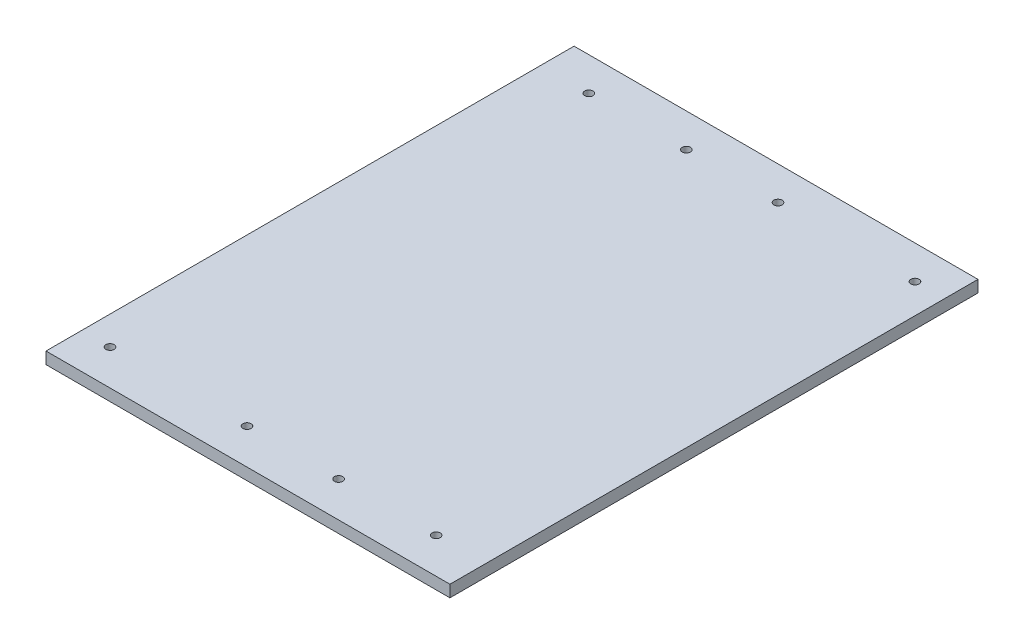
ISO-10303-21;
HEADER;
FILE_DESCRIPTION(('STEP AP214'),'2;1');
FILE_NAME('part.step','',(''),(''),'','','');
FILE_SCHEMA(('AUTOMOTIVE_DESIGN { 1 0 10303 214 1 1 1 1 }'));
ENDSEC;
DATA;
#1=APPLICATION_CONTEXT('core data for automotive mechanical design processes');
#2=APPLICATION_PROTOCOL_DEFINITION('international standard','automotive_design',2000,#1);
#3=PRODUCT_CONTEXT('',#1,'mechanical');
#4=PRODUCT('Part','Part','',(#3));
#5=PRODUCT_RELATED_PRODUCT_CATEGORY('part','',(#4));
#6=PRODUCT_DEFINITION_FORMATION('','',#4);
#7=PRODUCT_DEFINITION_CONTEXT('part definition',#1,'design');
#8=PRODUCT_DEFINITION('design','',#6,#7);
#9=PRODUCT_DEFINITION_SHAPE('','',#8);
#10=(LENGTH_UNIT() NAMED_UNIT(*) SI_UNIT(.MILLI.,.METRE.));
#11=(NAMED_UNIT(*) PLANE_ANGLE_UNIT() SI_UNIT($,.RADIAN.));
#12=(NAMED_UNIT(*) SI_UNIT($,.STERADIAN.) SOLID_ANGLE_UNIT());
#13=UNCERTAINTY_MEASURE_WITH_UNIT(LENGTH_MEASURE(1.E-05),#10,'distance_accuracy_value','');
#14=(GEOMETRIC_REPRESENTATION_CONTEXT(3) GLOBAL_UNCERTAINTY_ASSIGNED_CONTEXT((#13)) GLOBAL_UNIT_ASSIGNED_CONTEXT((#10,
#11,#12)) REPRESENTATION_CONTEXT('',''));
#15=CARTESIAN_POINT('',(0.,0.,0.));
#16=DIRECTION('',(0.,0.,1.));
#17=DIRECTION('',(1.,0.,0.));
#18=AXIS2_PLACEMENT_3D('',#15,#16,#17);
#19=CARTESIAN_POINT('',(102.5,6.,-134.));
#20=DIRECTION('',(1.,0.,0.));
#21=DIRECTION('',(0.,0.,-1.));
#22=AXIS2_PLACEMENT_3D('',#19,#20,#21);
#23=PLANE('',#22);
#24=DIRECTION('',(0.,0.,1.));
#25=VECTOR('',#24,1.);
#26=CARTESIAN_POINT('',(102.5,0.,-134.));
#27=LINE('',#26,#25);
#28=CARTESIAN_POINT('',(102.5,0.,-134.));
#29=VERTEX_POINT('',#28);
#30=CARTESIAN_POINT('',(102.5,0.,134.));
#31=VERTEX_POINT('',#30);
#32=EDGE_CURVE('E106',#29,#31,#27,.T.);
#33=ORIENTED_EDGE('',*,*,#32,.F.);
#34=DIRECTION('',(0.,-1.,0.));
#35=VECTOR('',#34,1.);
#36=CARTESIAN_POINT('',(102.5,6.,-134.));
#37=LINE('',#36,#35);
#38=CARTESIAN_POINT('',(102.5,6.,-134.));
#39=VERTEX_POINT('',#38);
#40=EDGE_CURVE('E12',#39,#29,#37,.T.);
#41=ORIENTED_EDGE('',*,*,#40,.F.);
#42=DIRECTION('',(0.,0.,1.));
#43=VECTOR('',#42,1.);
#44=CARTESIAN_POINT('',(102.5,6.,-134.));
#45=LINE('',#44,#43);
#46=CARTESIAN_POINT('',(102.5,6.,134.));
#47=VERTEX_POINT('',#46);
#48=EDGE_CURVE('E99',#39,#47,#45,.T.);
#49=ORIENTED_EDGE('',*,*,#48,.T.);
#50=DIRECTION('',(0.,-1.,0.));
#51=VECTOR('',#50,1.);
#52=CARTESIAN_POINT('',(102.5,6.,134.));
#53=LINE('',#52,#51);
#54=EDGE_CURVE('E44',#47,#31,#53,.T.);
#55=ORIENTED_EDGE('',*,*,#54,.T.);
#56=EDGE_LOOP('',(#33,#41,#49,#55));
#57=FACE_BOUND('',#56,.T.);
#58=ADVANCED_FACE('F41',(#57),#23,.T.);
#59=CARTESIAN_POINT('',(-102.5,6.,-134.));
#60=DIRECTION('',(0.,0.,-1.));
#61=DIRECTION('',(-1.,0.,0.));
#62=AXIS2_PLACEMENT_3D('',#59,#60,#61);
#63=PLANE('',#62);
#64=DIRECTION('',(1.,0.,0.));
#65=VECTOR('',#64,1.);
#66=CARTESIAN_POINT('',(-102.5,0.,-134.));
#67=LINE('',#66,#65);
#68=CARTESIAN_POINT('',(-102.5,0.,-134.));
#69=VERTEX_POINT('',#68);
#70=EDGE_CURVE('E101',#69,#29,#67,.T.);
#71=ORIENTED_EDGE('',*,*,#70,.F.);
#72=DIRECTION('',(0.,-1.,0.));
#73=VECTOR('',#72,1.);
#74=CARTESIAN_POINT('',(-102.5,6.,-134.));
#75=LINE('',#74,#73);
#76=CARTESIAN_POINT('',(-102.5,6.,-134.));
#77=VERTEX_POINT('',#76);
#78=EDGE_CURVE('E50',#77,#69,#75,.T.);
#79=ORIENTED_EDGE('',*,*,#78,.F.);
#80=DIRECTION('',(1.,0.,0.));
#81=VECTOR('',#80,1.);
#82=CARTESIAN_POINT('',(-102.5,6.,-134.));
#83=LINE('',#82,#81);
#84=EDGE_CURVE('E96',#77,#39,#83,.T.);
#85=ORIENTED_EDGE('',*,*,#84,.T.);
#86=ORIENTED_EDGE('',*,*,#40,.T.);
#87=EDGE_LOOP('',(#71,#79,#85,#86));
#88=FACE_BOUND('',#87,.T.);
#89=ADVANCED_FACE('F125',(#88),#63,.T.);
#90=CARTESIAN_POINT('',(-102.5,6.,-134.));
#91=DIRECTION('',(-1.,0.,0.));
#92=DIRECTION('',(0.,0.,1.));
#93=AXIS2_PLACEMENT_3D('',#90,#91,#92);
#94=PLANE('',#93);
#95=DIRECTION('',(0.,0.,-1.));
#96=VECTOR('',#95,1.);
#97=CARTESIAN_POINT('',(-102.5,0.,-134.));
#98=LINE('',#97,#96);
#99=CARTESIAN_POINT('',(-102.5,0.,134.));
#100=VERTEX_POINT('',#99);
#101=EDGE_CURVE('E91',#100,#69,#98,.T.);
#102=ORIENTED_EDGE('',*,*,#101,.F.);
#103=DIRECTION('',(0.,-1.,0.));
#104=VECTOR('',#103,1.);
#105=CARTESIAN_POINT('',(-102.5,6.,134.));
#106=LINE('',#105,#104);
#107=CARTESIAN_POINT('',(-102.5,6.,134.));
#108=VERTEX_POINT('',#107);
#109=EDGE_CURVE('E86',#108,#100,#106,.T.);
#110=ORIENTED_EDGE('',*,*,#109,.F.);
#111=DIRECTION('',(0.,0.,-1.));
#112=VECTOR('',#111,1.);
#113=CARTESIAN_POINT('',(-102.5,6.,-134.));
#114=LINE('',#113,#112);
#115=EDGE_CURVE('E89',#108,#77,#114,.T.);
#116=ORIENTED_EDGE('',*,*,#115,.T.);
#117=ORIENTED_EDGE('',*,*,#78,.T.);
#118=EDGE_LOOP('',(#102,#110,#116,#117));
#119=FACE_BOUND('',#118,.T.);
#120=ADVANCED_FACE('F88',(#119),#94,.T.);
#121=CARTESIAN_POINT('',(-102.5,6.,134.));
#122=DIRECTION('',(0.,0.,1.));
#123=DIRECTION('',(1.,0.,0.));
#124=AXIS2_PLACEMENT_3D('',#121,#122,#123);
#125=PLANE('',#124);
#126=DIRECTION('',(-1.,0.,0.));
#127=VECTOR('',#126,1.);
#128=CARTESIAN_POINT('',(-102.5,0.,134.));
#129=LINE('',#128,#127);
#130=EDGE_CURVE('E110',#31,#100,#129,.T.);
#131=ORIENTED_EDGE('',*,*,#130,.F.);
#132=ORIENTED_EDGE('',*,*,#54,.F.);
#133=DIRECTION('',(-1.,0.,0.));
#134=VECTOR('',#133,1.);
#135=CARTESIAN_POINT('',(-102.5,6.,134.));
#136=LINE('',#135,#134);
#137=EDGE_CURVE('E95',#47,#108,#136,.T.);
#138=ORIENTED_EDGE('',*,*,#137,.T.);
#139=ORIENTED_EDGE('',*,*,#109,.T.);
#140=EDGE_LOOP('',(#131,#132,#138,#139));
#141=FACE_BOUND('',#140,.T.);
#142=ADVANCED_FACE('F98',(#141),#125,.T.);
#143=CARTESIAN_POINT('',(0.,6.,0.));
#144=DIRECTION('',(0.,1.,0.));
#145=DIRECTION('',(0.,0.,1.));
#146=AXIS2_PLACEMENT_3D('',#143,#144,#145);
#147=PLANE('',#146);
#148=CARTESIAN_POINT('',(87.5,6.,-117.000000000001));
#149=DIRECTION('',(0.,-1.,0.));
#150=DIRECTION('',(0.,0.,-1.));
#151=AXIS2_PLACEMENT_3D('',#148,#149,#150);
#152=CIRCLE('',#151,2.1);
#153=CARTESIAN_POINT('',(87.5,6.,-119.100000000001));
#154=VERTEX_POINT('',#153);
#155=EDGE_CURVE('E182',#154,#154,#152,.T.);
#156=ORIENTED_EDGE('',*,*,#155,.T.);
#157=EDGE_LOOP('',(#156));
#158=FACE_BOUND('',#157,.T.);
#159=CARTESIAN_POINT('',(18.,6.,-117.000000000001));
#160=DIRECTION('',(0.,-1.,0.));
#161=DIRECTION('',(0.,0.,-1.));
#162=AXIS2_PLACEMENT_3D('',#159,#160,#161);
#163=CIRCLE('',#162,2.1);
#164=CARTESIAN_POINT('',(18.,6.,-119.100000000001));
#165=VERTEX_POINT('',#164);
#166=EDGE_CURVE('E199',#165,#165,#163,.T.);
#167=ORIENTED_EDGE('',*,*,#166,.T.);
#168=EDGE_LOOP('',(#167));
#169=FACE_BOUND('',#168,.T.);
#170=CARTESIAN_POINT('',(77.5,6.,115.999999999999));
#171=DIRECTION('',(0.,-1.,0.));
#172=DIRECTION('',(0.,0.,-1.));
#173=AXIS2_PLACEMENT_3D('',#170,#171,#172);
#174=CIRCLE('',#173,2.1);
#175=CARTESIAN_POINT('',(77.5,6.,113.899999999999));
#176=VERTEX_POINT('',#175);
#177=EDGE_CURVE('E205',#176,#176,#174,.T.);
#178=ORIENTED_EDGE('',*,*,#177,.T.);
#179=EDGE_LOOP('',(#178));
#180=FACE_BOUND('',#179,.T.);
#181=CARTESIAN_POINT('',(28.,6.,115.999999999999));
#182=DIRECTION('',(0.,-1.,0.));
#183=DIRECTION('',(0.,0.,-1.));
#184=AXIS2_PLACEMENT_3D('',#181,#182,#183);
#185=CIRCLE('',#184,2.1);
#186=CARTESIAN_POINT('',(28.,6.,113.899999999999));
#187=VERTEX_POINT('',#186);
#188=EDGE_CURVE('E212',#187,#187,#185,.T.);
#189=ORIENTED_EDGE('',*,*,#188,.T.);
#190=EDGE_LOOP('',(#189));
#191=FACE_BOUND('',#190,.T.);
#192=CARTESIAN_POINT('',(-18.5,6.,116.));
#193=DIRECTION('',(0.,-1.,0.));
#194=DIRECTION('',(0.,0.,-1.));
#195=AXIS2_PLACEMENT_3D('',#192,#193,#194);
#196=CIRCLE('',#195,2.1);
#197=CARTESIAN_POINT('',(-18.5,6.,113.9));
#198=VERTEX_POINT('',#197);
#199=EDGE_CURVE('E221',#198,#198,#196,.T.);
#200=ORIENTED_EDGE('',*,*,#199,.T.);
#201=EDGE_LOOP('',(#200));
#202=FACE_BOUND('',#201,.T.);
#203=CARTESIAN_POINT('',(-88.,6.,116.));
#204=DIRECTION('',(0.,-1.,0.));
#205=DIRECTION('',(0.,0.,-1.));
#206=AXIS2_PLACEMENT_3D('',#203,#204,#205);
#207=CIRCLE('',#206,2.1);
#208=CARTESIAN_POINT('',(-88.,6.,113.9));
#209=VERTEX_POINT('',#208);
#210=EDGE_CURVE('E227',#209,#209,#207,.T.);
#211=ORIENTED_EDGE('',*,*,#210,.T.);
#212=EDGE_LOOP('',(#211));
#213=FACE_BOUND('',#212,.T.);
#214=CARTESIAN_POINT('',(-28.5,6.,-117.));
#215=DIRECTION('',(0.,-1.,0.));
#216=DIRECTION('',(0.,0.,-1.));
#217=AXIS2_PLACEMENT_3D('',#214,#215,#216);
#218=CIRCLE('',#217,2.1);
#219=CARTESIAN_POINT('',(-28.5,6.,-119.1));
#220=VERTEX_POINT('',#219);
#221=EDGE_CURVE('E234',#220,#220,#218,.T.);
#222=ORIENTED_EDGE('',*,*,#221,.T.);
#223=EDGE_LOOP('',(#222));
#224=FACE_BOUND('',#223,.T.);
#225=CARTESIAN_POINT('',(-78.,6.,-117.));
#226=DIRECTION('',(0.,-1.,0.));
#227=DIRECTION('',(0.,0.,-1.));
#228=AXIS2_PLACEMENT_3D('',#225,#226,#227);
#229=CIRCLE('',#228,2.1);
#230=CARTESIAN_POINT('',(-78.,6.,-119.1));
#231=VERTEX_POINT('',#230);
#232=EDGE_CURVE('E111',#231,#231,#229,.T.);
#233=ORIENTED_EDGE('',*,*,#232,.T.);
#234=EDGE_LOOP('',(#233));
#235=FACE_BOUND('',#234,.T.);
#236=ORIENTED_EDGE('',*,*,#48,.F.);
#237=ORIENTED_EDGE('',*,*,#84,.F.);
#238=ORIENTED_EDGE('',*,*,#115,.F.);
#239=ORIENTED_EDGE('',*,*,#137,.F.);
#240=EDGE_LOOP('',(#236,#237,#238,#239));
#241=FACE_BOUND('',#240,.T.);
#242=ADVANCED_FACE('F94',(#158,#169,#180,#191,#202,#213,#224,#235,#241),#147,.T.);
#243=CARTESIAN_POINT('',(0.,0.,0.));
#244=DIRECTION('',(0.,1.,0.));
#245=DIRECTION('',(0.,0.,1.));
#246=AXIS2_PLACEMENT_3D('',#243,#244,#245);
#247=PLANE('',#246);
#248=CARTESIAN_POINT('',(87.5,0.,-117.000000000001));
#249=DIRECTION('',(0.,-1.,0.));
#250=DIRECTION('',(0.,0.,-1.));
#251=AXIS2_PLACEMENT_3D('',#248,#249,#250);
#252=CIRCLE('',#251,2.1);
#253=CARTESIAN_POINT('',(87.5,0.,-119.100000000001));
#254=VERTEX_POINT('',#253);
#255=EDGE_CURVE('E185',#254,#254,#252,.T.);
#256=ORIENTED_EDGE('',*,*,#255,.F.);
#257=EDGE_LOOP('',(#256));
#258=FACE_BOUND('',#257,.T.);
#259=CARTESIAN_POINT('',(18.,0.,-117.000000000001));
#260=DIRECTION('',(0.,-1.,0.));
#261=DIRECTION('',(0.,0.,-1.));
#262=AXIS2_PLACEMENT_3D('',#259,#260,#261);
#263=CIRCLE('',#262,2.1);
#264=CARTESIAN_POINT('',(18.,0.,-119.100000000001));
#265=VERTEX_POINT('',#264);
#266=EDGE_CURVE('E187',#265,#265,#263,.T.);
#267=ORIENTED_EDGE('',*,*,#266,.F.);
#268=EDGE_LOOP('',(#267));
#269=FACE_BOUND('',#268,.T.);
#270=CARTESIAN_POINT('',(77.5,0.,115.999999999999));
#271=DIRECTION('',(0.,-1.,0.));
#272=DIRECTION('',(0.,0.,-1.));
#273=AXIS2_PLACEMENT_3D('',#270,#271,#272);
#274=CIRCLE('',#273,2.1);
#275=CARTESIAN_POINT('',(77.5,0.,113.899999999999));
#276=VERTEX_POINT('',#275);
#277=EDGE_CURVE('E201',#276,#276,#274,.T.);
#278=ORIENTED_EDGE('',*,*,#277,.F.);
#279=EDGE_LOOP('',(#278));
#280=FACE_BOUND('',#279,.T.);
#281=CARTESIAN_POINT('',(28.,0.,115.999999999999));
#282=DIRECTION('',(0.,-1.,0.));
#283=DIRECTION('',(0.,0.,-1.));
#284=AXIS2_PLACEMENT_3D('',#281,#282,#283);
#285=CIRCLE('',#284,2.1);
#286=CARTESIAN_POINT('',(28.,0.,113.899999999999));
#287=VERTEX_POINT('',#286);
#288=EDGE_CURVE('E208',#287,#287,#285,.T.);
#289=ORIENTED_EDGE('',*,*,#288,.F.);
#290=EDGE_LOOP('',(#289));
#291=FACE_BOUND('',#290,.T.);
#292=CARTESIAN_POINT('',(-18.5,0.,116.));
#293=DIRECTION('',(0.,-1.,0.));
#294=DIRECTION('',(0.,0.,-1.));
#295=AXIS2_PLACEMENT_3D('',#292,#293,#294);
#296=CIRCLE('',#295,2.1);
#297=CARTESIAN_POINT('',(-18.5,0.,113.9));
#298=VERTEX_POINT('',#297);
#299=EDGE_CURVE('E217',#298,#298,#296,.T.);
#300=ORIENTED_EDGE('',*,*,#299,.F.);
#301=EDGE_LOOP('',(#300));
#302=FACE_BOUND('',#301,.T.);
#303=CARTESIAN_POINT('',(-88.,0.,116.));
#304=DIRECTION('',(0.,-1.,0.));
#305=DIRECTION('',(0.,0.,-1.));
#306=AXIS2_PLACEMENT_3D('',#303,#304,#305);
#307=CIRCLE('',#306,2.1);
#308=CARTESIAN_POINT('',(-88.,0.,113.9));
#309=VERTEX_POINT('',#308);
#310=EDGE_CURVE('E223',#309,#309,#307,.T.);
#311=ORIENTED_EDGE('',*,*,#310,.F.);
#312=EDGE_LOOP('',(#311));
#313=FACE_BOUND('',#312,.T.);
#314=CARTESIAN_POINT('',(-28.5,0.,-117.));
#315=DIRECTION('',(0.,-1.,0.));
#316=DIRECTION('',(0.,0.,-1.));
#317=AXIS2_PLACEMENT_3D('',#314,#315,#316);
#318=CIRCLE('',#317,2.1);
#319=CARTESIAN_POINT('',(-28.5,0.,-119.1));
#320=VERTEX_POINT('',#319);
#321=EDGE_CURVE('E230',#320,#320,#318,.T.);
#322=ORIENTED_EDGE('',*,*,#321,.F.);
#323=EDGE_LOOP('',(#322));
#324=FACE_BOUND('',#323,.T.);
#325=CARTESIAN_POINT('',(-78.,0.,-117.));
#326=DIRECTION('',(0.,-1.,0.));
#327=DIRECTION('',(0.,0.,-1.));
#328=AXIS2_PLACEMENT_3D('',#325,#326,#327);
#329=CIRCLE('',#328,2.1);
#330=CARTESIAN_POINT('',(-78.,0.,-119.1));
#331=VERTEX_POINT('',#330);
#332=EDGE_CURVE('E236',#331,#331,#329,.T.);
#333=ORIENTED_EDGE('',*,*,#332,.F.);
#334=EDGE_LOOP('',(#333));
#335=FACE_BOUND('',#334,.T.);
#336=ORIENTED_EDGE('',*,*,#32,.T.);
#337=ORIENTED_EDGE('',*,*,#130,.T.);
#338=ORIENTED_EDGE('',*,*,#101,.T.);
#339=ORIENTED_EDGE('',*,*,#70,.T.);
#340=EDGE_LOOP('',(#336,#337,#338,#339));
#341=FACE_BOUND('',#340,.T.);
#342=ADVANCED_FACE('F124',(#258,#269,#280,#291,#302,#313,#324,#335,#341),#247,.F.);
#343=CARTESIAN_POINT('',(-78.,0.,-117.));
#344=DIRECTION('',(0.,-1.,0.));
#345=DIRECTION('',(0.,0.,-1.));
#346=AXIS2_PLACEMENT_3D('',#343,#344,#345);
#347=CYLINDRICAL_SURFACE('',#346,2.1);
#348=ORIENTED_EDGE('',*,*,#232,.F.);
#349=EDGE_LOOP('',(#348));
#350=FACE_BOUND('',#349,.T.);
#351=ORIENTED_EDGE('',*,*,#332,.T.);
#352=EDGE_LOOP('',(#351));
#353=FACE_BOUND('',#352,.T.);
#354=ADVANCED_FACE('F143',(#350,#353),#347,.F.);
#355=CARTESIAN_POINT('',(-28.5,0.,-117.));
#356=DIRECTION('',(0.,-1.,0.));
#357=DIRECTION('',(0.,0.,-1.));
#358=AXIS2_PLACEMENT_3D('',#355,#356,#357);
#359=CYLINDRICAL_SURFACE('',#358,2.1);
#360=ORIENTED_EDGE('',*,*,#221,.F.);
#361=EDGE_LOOP('',(#360));
#362=FACE_BOUND('',#361,.T.);
#363=ORIENTED_EDGE('',*,*,#321,.T.);
#364=EDGE_LOOP('',(#363));
#365=FACE_BOUND('',#364,.T.);
#366=ADVANCED_FACE('F150',(#362,#365),#359,.F.);
#367=CARTESIAN_POINT('',(-88.,0.,116.));
#368=DIRECTION('',(0.,-1.,0.));
#369=DIRECTION('',(0.,0.,-1.));
#370=AXIS2_PLACEMENT_3D('',#367,#368,#369);
#371=CYLINDRICAL_SURFACE('',#370,2.1);
#372=ORIENTED_EDGE('',*,*,#210,.F.);
#373=EDGE_LOOP('',(#372));
#374=FACE_BOUND('',#373,.T.);
#375=ORIENTED_EDGE('',*,*,#310,.T.);
#376=EDGE_LOOP('',(#375));
#377=FACE_BOUND('',#376,.T.);
#378=ADVANCED_FACE('F154',(#374,#377),#371,.F.);
#379=CARTESIAN_POINT('',(-18.5,0.,116.));
#380=DIRECTION('',(0.,-1.,0.));
#381=DIRECTION('',(0.,0.,-1.));
#382=AXIS2_PLACEMENT_3D('',#379,#380,#381);
#383=CYLINDRICAL_SURFACE('',#382,2.1);
#384=ORIENTED_EDGE('',*,*,#199,.F.);
#385=EDGE_LOOP('',(#384));
#386=FACE_BOUND('',#385,.T.);
#387=ORIENTED_EDGE('',*,*,#299,.T.);
#388=EDGE_LOOP('',(#387));
#389=FACE_BOUND('',#388,.T.);
#390=ADVANCED_FACE('F158',(#386,#389),#383,.F.);
#391=CARTESIAN_POINT('',(28.,0.,115.999999999999));
#392=DIRECTION('',(0.,-1.,0.));
#393=DIRECTION('',(0.,0.,-1.));
#394=AXIS2_PLACEMENT_3D('',#391,#392,#393);
#395=CYLINDRICAL_SURFACE('',#394,2.1);
#396=ORIENTED_EDGE('',*,*,#188,.F.);
#397=EDGE_LOOP('',(#396));
#398=FACE_BOUND('',#397,.T.);
#399=ORIENTED_EDGE('',*,*,#288,.T.);
#400=EDGE_LOOP('',(#399));
#401=FACE_BOUND('',#400,.T.);
#402=ADVANCED_FACE('F162',(#398,#401),#395,.F.);
#403=CARTESIAN_POINT('',(77.5,0.,115.999999999999));
#404=DIRECTION('',(0.,-1.,0.));
#405=DIRECTION('',(0.,0.,-1.));
#406=AXIS2_PLACEMENT_3D('',#403,#404,#405);
#407=CYLINDRICAL_SURFACE('',#406,2.1);
#408=ORIENTED_EDGE('',*,*,#177,.F.);
#409=EDGE_LOOP('',(#408));
#410=FACE_BOUND('',#409,.T.);
#411=ORIENTED_EDGE('',*,*,#277,.T.);
#412=EDGE_LOOP('',(#411));
#413=FACE_BOUND('',#412,.T.);
#414=ADVANCED_FACE('F166',(#410,#413),#407,.F.);
#415=CARTESIAN_POINT('',(18.,0.,-117.000000000001));
#416=DIRECTION('',(0.,-1.,0.));
#417=DIRECTION('',(0.,0.,-1.));
#418=AXIS2_PLACEMENT_3D('',#415,#416,#417);
#419=CYLINDRICAL_SURFACE('',#418,2.1);
#420=ORIENTED_EDGE('',*,*,#166,.F.);
#421=EDGE_LOOP('',(#420));
#422=FACE_BOUND('',#421,.T.);
#423=ORIENTED_EDGE('',*,*,#266,.T.);
#424=EDGE_LOOP('',(#423));
#425=FACE_BOUND('',#424,.T.);
#426=ADVANCED_FACE('F170',(#422,#425),#419,.F.);
#427=CARTESIAN_POINT('',(87.5,0.,-117.000000000001));
#428=DIRECTION('',(0.,-1.,0.));
#429=DIRECTION('',(0.,0.,-1.));
#430=AXIS2_PLACEMENT_3D('',#427,#428,#429);
#431=CYLINDRICAL_SURFACE('',#430,2.1);
#432=ORIENTED_EDGE('',*,*,#155,.F.);
#433=EDGE_LOOP('',(#432));
#434=FACE_BOUND('',#433,.T.);
#435=ORIENTED_EDGE('',*,*,#255,.T.);
#436=EDGE_LOOP('',(#435));
#437=FACE_BOUND('',#436,.T.);
#438=ADVANCED_FACE('F174',(#434,#437),#431,.F.);
#439=CLOSED_SHELL('',(#58,#89,#120,#142,#242,#342,#354,#366,#378,#390,#402,#414,#426,#438));
#440=MANIFOLD_SOLID_BREP('B2',#439);
#441=ADVANCED_BREP_SHAPE_REPRESENTATION('',(#18,#440),#14);
#442=SHAPE_DEFINITION_REPRESENTATION(#9,#441);
ENDSEC;
END-ISO-10303-21;
